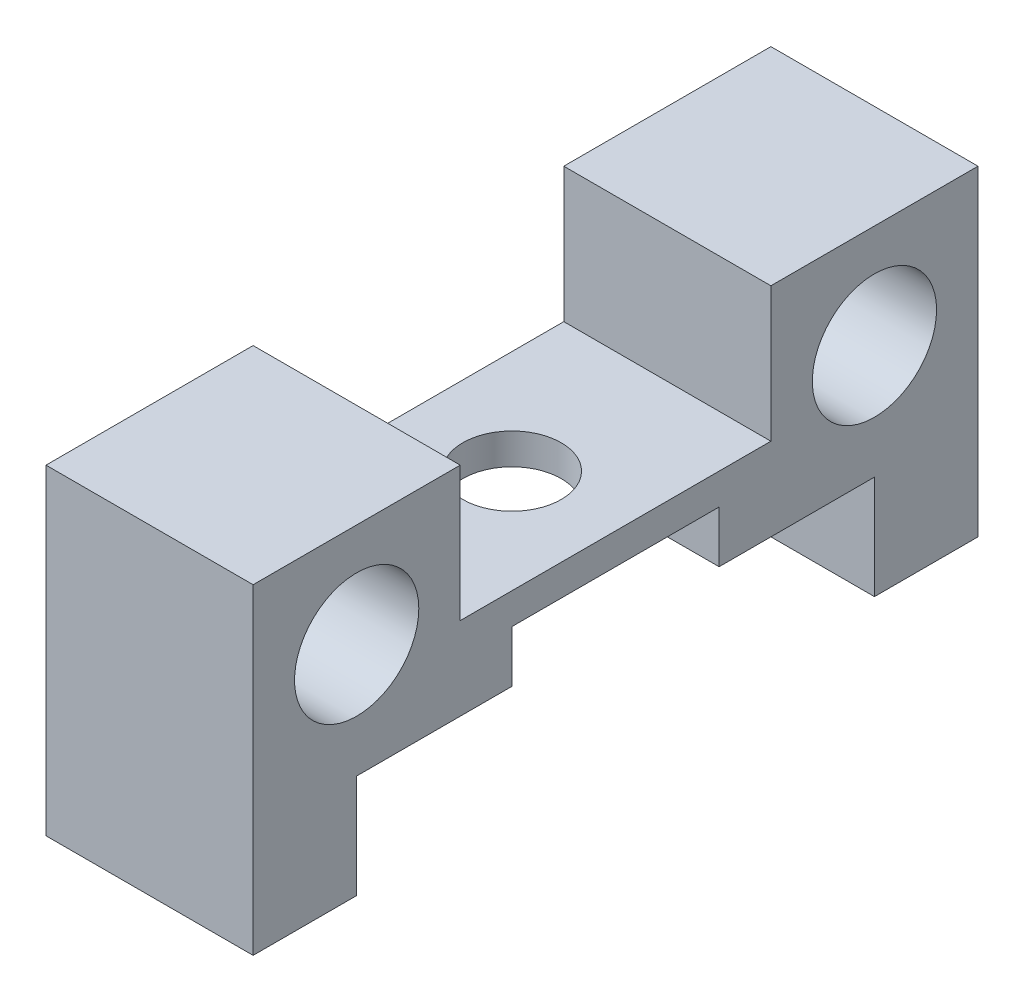
ISO-10303-21;
HEADER;
FILE_DESCRIPTION(('STEP AP214'),'2;1');
FILE_NAME('part.step','',(''),(''),'','','');
FILE_SCHEMA(('AUTOMOTIVE_DESIGN { 1 0 10303 214 1 1 1 1 }'));
ENDSEC;
DATA;
#1=APPLICATION_CONTEXT('core data for automotive mechanical design processes');
#2=APPLICATION_PROTOCOL_DEFINITION('international standard','automotive_design',2000,#1);
#3=PRODUCT_CONTEXT('',#1,'mechanical');
#4=PRODUCT('Part','Part','',(#3));
#5=PRODUCT_RELATED_PRODUCT_CATEGORY('part','',(#4));
#6=PRODUCT_DEFINITION_FORMATION('','',#4);
#7=PRODUCT_DEFINITION_CONTEXT('part definition',#1,'design');
#8=PRODUCT_DEFINITION('design','',#6,#7);
#9=PRODUCT_DEFINITION_SHAPE('','',#8);
#10=(LENGTH_UNIT() NAMED_UNIT(*) SI_UNIT(.MILLI.,.METRE.));
#11=(NAMED_UNIT(*) PLANE_ANGLE_UNIT() SI_UNIT($,.RADIAN.));
#12=(NAMED_UNIT(*) SI_UNIT($,.STERADIAN.) SOLID_ANGLE_UNIT());
#13=UNCERTAINTY_MEASURE_WITH_UNIT(LENGTH_MEASURE(1.E-05),#10,'distance_accuracy_value','');
#14=(GEOMETRIC_REPRESENTATION_CONTEXT(3) GLOBAL_UNCERTAINTY_ASSIGNED_CONTEXT((#13)) GLOBAL_UNIT_ASSIGNED_CONTEXT((#10,
#11,#12)) REPRESENTATION_CONTEXT('',''));
#15=CARTESIAN_POINT('',(0.,0.,0.));
#16=DIRECTION('',(0.,0.,1.));
#17=DIRECTION('',(1.,0.,0.));
#18=AXIS2_PLACEMENT_3D('',#15,#16,#17);
#19=CARTESIAN_POINT('',(0.,0.,70.));
#20=DIRECTION('',(0.,1.,0.));
#21=DIRECTION('',(0.,0.,1.));
#22=AXIS2_PLACEMENT_3D('',#19,#20,#21);
#23=PLANE('',#22);
#24=CARTESIAN_POINT('',(15.,0.,5.));
#25=DIRECTION('',(0.,-1.,0.));
#26=DIRECTION('',(0.,0.,-1.));
#27=AXIS2_PLACEMENT_3D('',#24,#25,#26);
#28=CIRCLE('',#27,1.5);
#29=CARTESIAN_POINT('',(15.,0.,3.5));
#30=VERTEX_POINT('',#29);
#31=EDGE_CURVE('E563',#30,#30,#28,.T.);
#32=ORIENTED_EDGE('',*,*,#31,.F.);
#33=EDGE_LOOP('',(#32));
#34=FACE_BOUND('',#33,.T.);
#35=CARTESIAN_POINT('',(5.,0.,5.));
#36=DIRECTION('',(0.,-1.,0.));
#37=DIRECTION('',(0.,0.,-1.));
#38=AXIS2_PLACEMENT_3D('',#35,#36,#37);
#39=CIRCLE('',#38,1.5);
#40=CARTESIAN_POINT('',(5.,0.,3.5));
#41=VERTEX_POINT('',#40);
#42=EDGE_CURVE('E365',#41,#41,#39,.T.);
#43=ORIENTED_EDGE('',*,*,#42,.F.);
#44=EDGE_LOOP('',(#43));
#45=FACE_BOUND('',#44,.T.);
#46=DIRECTION('',(0.,0.,-1.));
#47=VECTOR('',#46,1.);
#48=CARTESIAN_POINT('',(20.,0.,70.));
#49=LINE('',#48,#47);
#50=CARTESIAN_POINT('',(20.,0.,10.));
#51=VERTEX_POINT('',#50);
#52=CARTESIAN_POINT('',(20.,0.,0.));
#53=VERTEX_POINT('',#52);
#54=EDGE_CURVE('E265',#51,#53,#49,.T.);
#55=ORIENTED_EDGE('',*,*,#54,.F.);
#56=DIRECTION('',(1.,0.,0.));
#57=VECTOR('',#56,1.);
#58=CARTESIAN_POINT('',(0.,0.,10.));
#59=LINE('',#58,#57);
#60=CARTESIAN_POINT('',(0.,0.,10.));
#61=VERTEX_POINT('',#60);
#62=EDGE_CURVE('E207',#61,#51,#59,.T.);
#63=ORIENTED_EDGE('',*,*,#62,.F.);
#64=DIRECTION('',(0.,0.,-1.));
#65=VECTOR('',#64,1.);
#66=CARTESIAN_POINT('',(0.,0.,70.));
#67=LINE('',#66,#65);
#68=CARTESIAN_POINT('',(0.,0.,0.));
#69=VERTEX_POINT('',#68);
#70=EDGE_CURVE('E40',#61,#69,#67,.T.);
#71=ORIENTED_EDGE('',*,*,#70,.T.);
#72=DIRECTION('',(1.,0.,0.));
#73=VECTOR('',#72,1.);
#74=CARTESIAN_POINT('',(0.,0.,0.));
#75=LINE('',#74,#73);
#76=EDGE_CURVE('E250',#69,#53,#75,.T.);
#77=ORIENTED_EDGE('',*,*,#76,.T.);
#78=EDGE_LOOP('',(#55,#63,#71,#77));
#79=FACE_BOUND('',#78,.T.);
#80=ADVANCED_FACE('F31',(#34,#45,#79),#23,.F.);
#81=CARTESIAN_POINT('',(0.,31.,70.));
#82=DIRECTION('',(0.,-1.,0.));
#83=DIRECTION('',(0.,0.,-1.));
#84=AXIS2_PLACEMENT_3D('',#81,#82,#83);
#85=PLANE('',#84);
#86=DIRECTION('',(0.,0.,-1.));
#87=VECTOR('',#86,1.);
#88=CARTESIAN_POINT('',(20.,31.,70.));
#89=LINE('',#88,#87);
#90=CARTESIAN_POINT('',(20.,31.,70.));
#91=VERTEX_POINT('',#90);
#92=CARTESIAN_POINT('',(20.,31.,50.));
#93=VERTEX_POINT('',#92);
#94=EDGE_CURVE('E262',#91,#93,#89,.T.);
#95=ORIENTED_EDGE('',*,*,#94,.T.);
#96=DIRECTION('',(1.,0.,0.));
#97=VECTOR('',#96,1.);
#98=CARTESIAN_POINT('',(0.,31.,50.));
#99=LINE('',#98,#97);
#100=CARTESIAN_POINT('',(0.,31.,50.));
#101=VERTEX_POINT('',#100);
#102=EDGE_CURVE('E229',#101,#93,#99,.T.);
#103=ORIENTED_EDGE('',*,*,#102,.F.);
#104=DIRECTION('',(0.,0.,-1.));
#105=VECTOR('',#104,1.);
#106=CARTESIAN_POINT('',(0.,31.,70.));
#107=LINE('',#106,#105);
#108=CARTESIAN_POINT('',(0.,31.,70.));
#109=VERTEX_POINT('',#108);
#110=EDGE_CURVE('E258',#109,#101,#107,.T.);
#111=ORIENTED_EDGE('',*,*,#110,.F.);
#112=DIRECTION('',(-1.,0.,0.));
#113=VECTOR('',#112,1.);
#114=CARTESIAN_POINT('',(0.,31.,70.));
#115=LINE('',#114,#113);
#116=EDGE_CURVE('E245',#91,#109,#115,.T.);
#117=ORIENTED_EDGE('',*,*,#116,.F.);
#118=EDGE_LOOP('',(#95,#103,#111,#117));
#119=FACE_BOUND('',#118,.T.);
#120=ADVANCED_FACE('F300',(#119),#85,.F.);
#121=CARTESIAN_POINT('',(0.,0.,70.));
#122=DIRECTION('',(1.,0.,0.));
#123=DIRECTION('',(0.,0.,-1.));
#124=AXIS2_PLACEMENT_3D('',#121,#122,#123);
#125=PLANE('',#124);
#126=CARTESIAN_POINT('',(0.,21.,10.));
#127=DIRECTION('',(1.,0.,0.));
#128=DIRECTION('',(0.,0.,-1.));
#129=AXIS2_PLACEMENT_3D('',#126,#127,#128);
#130=CIRCLE('',#129,6.);
#131=CARTESIAN_POINT('',(0.,21.,4.));
#132=VERTEX_POINT('',#131);
#133=EDGE_CURVE('E369',#132,#132,#130,.T.);
#134=ORIENTED_EDGE('',*,*,#133,.T.);
#135=EDGE_LOOP('',(#134));
#136=FACE_BOUND('',#135,.T.);
#137=CARTESIAN_POINT('',(0.,21.,60.));
#138=DIRECTION('',(1.,0.,0.));
#139=DIRECTION('',(0.,0.,-1.));
#140=AXIS2_PLACEMENT_3D('',#137,#138,#139);
#141=CIRCLE('',#140,5.99999999999999);
#142=CARTESIAN_POINT('',(0.,21.,54.));
#143=VERTEX_POINT('',#142);
#144=EDGE_CURVE('E375',#143,#143,#141,.T.);
#145=ORIENTED_EDGE('',*,*,#144,.T.);
#146=EDGE_LOOP('',(#145));
#147=FACE_BOUND('',#146,.T.);
#148=ORIENTED_EDGE('',*,*,#70,.F.);
#149=DIRECTION('',(0.,1.,0.));
#150=VECTOR('',#149,1.);
#151=CARTESIAN_POINT('',(0.,0.,10.));
#152=LINE('',#151,#150);
#153=CARTESIAN_POINT('',(0.,10.,10.));
#154=VERTEX_POINT('',#153);
#155=EDGE_CURVE('E176',#61,#154,#152,.T.);
#156=ORIENTED_EDGE('',*,*,#155,.T.);
#157=DIRECTION('',(0.,0.,1.));
#158=VECTOR('',#157,1.);
#159=CARTESIAN_POINT('',(0.,10.,10.));
#160=LINE('',#159,#158);
#161=CARTESIAN_POINT('',(0.,10.,25.));
#162=VERTEX_POINT('',#161);
#163=EDGE_CURVE('E179',#154,#162,#160,.T.);
#164=ORIENTED_EDGE('',*,*,#163,.T.);
#165=DIRECTION('',(0.,1.,0.));
#166=VECTOR('',#165,1.);
#167=CARTESIAN_POINT('',(0.,10.,25.));
#168=LINE('',#167,#166);
#169=CARTESIAN_POINT('',(0.,15.,25.));
#170=VERTEX_POINT('',#169);
#171=EDGE_CURVE('E182',#162,#170,#168,.T.);
#172=ORIENTED_EDGE('',*,*,#171,.T.);
#173=DIRECTION('',(0.,0.,1.));
#174=VECTOR('',#173,1.);
#175=CARTESIAN_POINT('',(0.,15.,45.));
#176=LINE('',#175,#174);
#177=CARTESIAN_POINT('',(0.,15.,45.));
#178=VERTEX_POINT('',#177);
#179=EDGE_CURVE('E153',#170,#178,#176,.T.);
#180=ORIENTED_EDGE('',*,*,#179,.T.);
#181=DIRECTION('',(0.,-1.,0.));
#182=VECTOR('',#181,1.);
#183=CARTESIAN_POINT('',(0.,9.99999999999999,45.));
#184=LINE('',#183,#182);
#185=CARTESIAN_POINT('',(0.,9.99999999999999,45.));
#186=VERTEX_POINT('',#185);
#187=EDGE_CURVE('E147',#178,#186,#184,.T.);
#188=ORIENTED_EDGE('',*,*,#187,.T.);
#189=DIRECTION('',(0.,0.,1.));
#190=VECTOR('',#189,1.);
#191=CARTESIAN_POINT('',(0.,9.99999999999999,45.));
#192=LINE('',#191,#190);
#193=CARTESIAN_POINT('',(0.,9.99999999999999,60.));
#194=VERTEX_POINT('',#193);
#195=EDGE_CURVE('E156',#186,#194,#192,.T.);
#196=ORIENTED_EDGE('',*,*,#195,.T.);
#197=DIRECTION('',(0.,-1.,0.));
#198=VECTOR('',#197,1.);
#199=CARTESIAN_POINT('',(0.,9.99999999999999,60.));
#200=LINE('',#199,#198);
#201=CARTESIAN_POINT('',(0.,0.,60.));
#202=VERTEX_POINT('',#201);
#203=EDGE_CURVE('E161',#194,#202,#200,.T.);
#204=ORIENTED_EDGE('',*,*,#203,.T.);
#205=CARTESIAN_POINT('',(0.,0.,70.));
#206=VERTEX_POINT('',#205);
#207=EDGE_CURVE('E11',#206,#202,#67,.T.);
#208=ORIENTED_EDGE('',*,*,#207,.F.);
#209=DIRECTION('',(0.,-1.,0.));
#210=VECTOR('',#209,1.);
#211=CARTESIAN_POINT('',(0.,0.,70.));
#212=LINE('',#211,#210);
#213=EDGE_CURVE('E237',#109,#206,#212,.T.);
#214=ORIENTED_EDGE('',*,*,#213,.F.);
#215=ORIENTED_EDGE('',*,*,#110,.T.);
#216=DIRECTION('',(0.,-1.,0.));
#217=VECTOR('',#216,1.);
#218=CARTESIAN_POINT('',(0.,31.,50.));
#219=LINE('',#218,#217);
#220=CARTESIAN_POINT('',(0.,18.,50.));
#221=VERTEX_POINT('',#220);
#222=EDGE_CURVE('E213',#101,#221,#219,.T.);
#223=ORIENTED_EDGE('',*,*,#222,.T.);
#224=DIRECTION('',(0.,0.,-1.));
#225=VECTOR('',#224,1.);
#226=CARTESIAN_POINT('',(0.,18.,50.));
#227=LINE('',#226,#225);
#228=CARTESIAN_POINT('',(0.,18.,20.));
#229=VERTEX_POINT('',#228);
#230=EDGE_CURVE('E216',#221,#229,#227,.T.);
#231=ORIENTED_EDGE('',*,*,#230,.T.);
#232=DIRECTION('',(0.,1.,0.));
#233=VECTOR('',#232,1.);
#234=CARTESIAN_POINT('',(0.,31.,20.));
#235=LINE('',#234,#233);
#236=CARTESIAN_POINT('',(0.,31.,20.));
#237=VERTEX_POINT('',#236);
#238=EDGE_CURVE('E219',#229,#237,#235,.T.);
#239=ORIENTED_EDGE('',*,*,#238,.T.);
#240=CARTESIAN_POINT('',(0.,31.,0.));
#241=VERTEX_POINT('',#240);
#242=EDGE_CURVE('E247',#237,#241,#107,.T.);
#243=ORIENTED_EDGE('',*,*,#242,.T.);
#244=DIRECTION('',(0.,-1.,0.));
#245=VECTOR('',#244,1.);
#246=CARTESIAN_POINT('',(0.,0.,0.));
#247=LINE('',#246,#245);
#248=EDGE_CURVE('E231',#241,#69,#247,.T.);
#249=ORIENTED_EDGE('',*,*,#248,.T.);
#250=EDGE_LOOP('',(#148,#156,#164,#172,#180,#188,#196,#204,#208,#214,#215,#223,#231,#239,#243,#249));
#251=FACE_BOUND('',#250,.T.);
#252=ADVANCED_FACE('F33',(#136,#147,#251),#125,.F.);
#253=CARTESIAN_POINT('',(15.,0.,65.));
#254=DIRECTION('',(0.,-1.,0.));
#255=DIRECTION('',(0.,0.,-1.));
#256=AXIS2_PLACEMENT_3D('',#253,#254,#255);
#257=CIRCLE('',#256,1.5);
#258=CARTESIAN_POINT('',(15.,0.,63.5));
#259=VERTEX_POINT('',#258);
#260=EDGE_CURVE('E353',#259,#259,#257,.T.);
#261=ORIENTED_EDGE('',*,*,#260,.F.);
#262=EDGE_LOOP('',(#261));
#263=FACE_BOUND('',#262,.T.);
#264=CARTESIAN_POINT('',(5.,0.,65.));
#265=DIRECTION('',(0.,-1.,0.));
#266=DIRECTION('',(0.,0.,-1.));
#267=AXIS2_PLACEMENT_3D('',#264,#265,#266);
#268=CIRCLE('',#267,1.5);
#269=CARTESIAN_POINT('',(5.,0.,63.5));
#270=VERTEX_POINT('',#269);
#271=EDGE_CURVE('E356',#270,#270,#268,.T.);
#272=ORIENTED_EDGE('',*,*,#271,.F.);
#273=EDGE_LOOP('',(#272));
#274=FACE_BOUND('',#273,.T.);
#275=ORIENTED_EDGE('',*,*,#207,.T.);
#276=DIRECTION('',(1.,0.,0.));
#277=VECTOR('',#276,1.);
#278=CARTESIAN_POINT('',(0.,0.,60.));
#279=LINE('',#278,#277);
#280=CARTESIAN_POINT('',(20.,0.,60.));
#281=VERTEX_POINT('',#280);
#282=EDGE_CURVE('E209',#202,#281,#279,.T.);
#283=ORIENTED_EDGE('',*,*,#282,.T.);
#284=CARTESIAN_POINT('',(20.,0.,70.));
#285=VERTEX_POINT('',#284);
#286=EDGE_CURVE('E266',#285,#281,#49,.T.);
#287=ORIENTED_EDGE('',*,*,#286,.F.);
#288=DIRECTION('',(1.,0.,0.));
#289=VECTOR('',#288,1.);
#290=CARTESIAN_POINT('',(0.,0.,70.));
#291=LINE('',#290,#289);
#292=EDGE_CURVE('E240',#206,#285,#291,.T.);
#293=ORIENTED_EDGE('',*,*,#292,.F.);
#294=EDGE_LOOP('',(#275,#283,#287,#293));
#295=FACE_BOUND('',#294,.T.);
#296=ADVANCED_FACE('F307',(#263,#274,#295),#23,.F.);
#297=CARTESIAN_POINT('',(20.,0.,70.));
#298=DIRECTION('',(-1.,0.,0.));
#299=DIRECTION('',(0.,0.,1.));
#300=AXIS2_PLACEMENT_3D('',#297,#298,#299);
#301=PLANE('',#300);
#302=CARTESIAN_POINT('',(20.,21.,10.));
#303=DIRECTION('',(1.,0.,0.));
#304=DIRECTION('',(0.,0.,-1.));
#305=AXIS2_PLACEMENT_3D('',#302,#303,#304);
#306=CIRCLE('',#305,6.);
#307=CARTESIAN_POINT('',(20.,21.,4.));
#308=VERTEX_POINT('',#307);
#309=EDGE_CURVE('E362',#308,#308,#306,.T.);
#310=ORIENTED_EDGE('',*,*,#309,.F.);
#311=EDGE_LOOP('',(#310));
#312=FACE_BOUND('',#311,.T.);
#313=CARTESIAN_POINT('',(20.,21.,60.));
#314=DIRECTION('',(1.,0.,0.));
#315=DIRECTION('',(0.,0.,-1.));
#316=AXIS2_PLACEMENT_3D('',#313,#314,#315);
#317=CIRCLE('',#316,5.99999999999999);
#318=CARTESIAN_POINT('',(20.,21.,54.));
#319=VERTEX_POINT('',#318);
#320=EDGE_CURVE('E372',#319,#319,#317,.T.);
#321=ORIENTED_EDGE('',*,*,#320,.F.);
#322=EDGE_LOOP('',(#321));
#323=FACE_BOUND('',#322,.T.);
#324=DIRECTION('',(0.,0.,1.));
#325=VECTOR('',#324,1.);
#326=CARTESIAN_POINT('',(20.,10.,10.));
#327=LINE('',#326,#325);
#328=CARTESIAN_POINT('',(20.,10.,10.));
#329=VERTEX_POINT('',#328);
#330=CARTESIAN_POINT('',(20.,10.,25.));
#331=VERTEX_POINT('',#330);
#332=EDGE_CURVE('E193',#329,#331,#327,.T.);
#333=ORIENTED_EDGE('',*,*,#332,.F.);
#334=DIRECTION('',(0.,1.,0.));
#335=VECTOR('',#334,1.);
#336=CARTESIAN_POINT('',(20.,0.,10.));
#337=LINE('',#336,#335);
#338=EDGE_CURVE('E190',#51,#329,#337,.T.);
#339=ORIENTED_EDGE('',*,*,#338,.F.);
#340=ORIENTED_EDGE('',*,*,#54,.T.);
#341=DIRECTION('',(0.,1.,0.));
#342=VECTOR('',#341,1.);
#343=CARTESIAN_POINT('',(20.,0.,0.));
#344=LINE('',#343,#342);
#345=CARTESIAN_POINT('',(20.,31.,0.));
#346=VERTEX_POINT('',#345);
#347=EDGE_CURVE('E253',#53,#346,#344,.T.);
#348=ORIENTED_EDGE('',*,*,#347,.T.);
#349=CARTESIAN_POINT('',(20.,31.,20.));
#350=VERTEX_POINT('',#349);
#351=EDGE_CURVE('E261',#350,#346,#89,.T.);
#352=ORIENTED_EDGE('',*,*,#351,.F.);
#353=DIRECTION('',(0.,1.,0.));
#354=VECTOR('',#353,1.);
#355=CARTESIAN_POINT('',(20.,31.,20.));
#356=LINE('',#355,#354);
#357=CARTESIAN_POINT('',(20.,18.,20.));
#358=VERTEX_POINT('',#357);
#359=EDGE_CURVE('E55',#358,#350,#356,.T.);
#360=ORIENTED_EDGE('',*,*,#359,.F.);
#361=DIRECTION('',(0.,0.,-1.));
#362=VECTOR('',#361,1.);
#363=CARTESIAN_POINT('',(20.,18.,50.));
#364=LINE('',#363,#362);
#365=CARTESIAN_POINT('',(20.,18.,50.));
#366=VERTEX_POINT('',#365);
#367=EDGE_CURVE('E225',#366,#358,#364,.T.);
#368=ORIENTED_EDGE('',*,*,#367,.F.);
#369=DIRECTION('',(0.,-1.,0.));
#370=VECTOR('',#369,1.);
#371=CARTESIAN_POINT('',(20.,31.,50.));
#372=LINE('',#371,#370);
#373=EDGE_CURVE('E200',#93,#366,#372,.T.);
#374=ORIENTED_EDGE('',*,*,#373,.F.);
#375=ORIENTED_EDGE('',*,*,#94,.F.);
#376=DIRECTION('',(0.,1.,0.));
#377=VECTOR('',#376,1.);
#378=CARTESIAN_POINT('',(20.,0.,70.));
#379=LINE('',#378,#377);
#380=EDGE_CURVE('E243',#285,#91,#379,.T.);
#381=ORIENTED_EDGE('',*,*,#380,.F.);
#382=ORIENTED_EDGE('',*,*,#286,.T.);
#383=DIRECTION('',(0.,-1.,0.));
#384=VECTOR('',#383,1.);
#385=CARTESIAN_POINT('',(20.,9.99999999999999,60.));
#386=LINE('',#385,#384);
#387=CARTESIAN_POINT('',(20.,9.99999999999999,60.));
#388=VERTEX_POINT('',#387);
#389=EDGE_CURVE('E188',#388,#281,#386,.T.);
#390=ORIENTED_EDGE('',*,*,#389,.F.);
#391=DIRECTION('',(0.,0.,1.));
#392=VECTOR('',#391,1.);
#393=CARTESIAN_POINT('',(20.,9.99999999999999,45.));
#394=LINE('',#393,#392);
#395=CARTESIAN_POINT('',(20.,9.99999999999999,45.));
#396=VERTEX_POINT('',#395);
#397=EDGE_CURVE('E186',#396,#388,#394,.T.);
#398=ORIENTED_EDGE('',*,*,#397,.F.);
#399=DIRECTION('',(0.,-1.,0.));
#400=VECTOR('',#399,1.);
#401=CARTESIAN_POINT('',(20.,9.99999999999999,45.));
#402=LINE('',#401,#400);
#403=CARTESIAN_POINT('',(20.,15.,45.));
#404=VERTEX_POINT('',#403);
#405=EDGE_CURVE('E47',#404,#396,#402,.T.);
#406=ORIENTED_EDGE('',*,*,#405,.F.);
#407=DIRECTION('',(0.,0.,1.));
#408=VECTOR('',#407,1.);
#409=CARTESIAN_POINT('',(20.,15.,45.));
#410=LINE('',#409,#408);
#411=CARTESIAN_POINT('',(20.,15.,25.));
#412=VERTEX_POINT('',#411);
#413=EDGE_CURVE('E166',#412,#404,#410,.T.);
#414=ORIENTED_EDGE('',*,*,#413,.F.);
#415=DIRECTION('',(0.,1.,0.));
#416=VECTOR('',#415,1.);
#417=CARTESIAN_POINT('',(20.,10.,25.));
#418=LINE('',#417,#416);
#419=EDGE_CURVE('E169',#331,#412,#418,.T.);
#420=ORIENTED_EDGE('',*,*,#419,.F.);
#421=EDGE_LOOP('',(#333,#339,#340,#348,#352,#360,#368,#374,#375,#381,#382,#390,#398,#406,#414,#420));
#422=FACE_BOUND('',#421,.T.);
#423=ADVANCED_FACE('F275',(#312,#323,#422),#301,.F.);
#424=ORIENTED_EDGE('',*,*,#242,.F.);
#425=DIRECTION('',(1.,0.,0.));
#426=VECTOR('',#425,1.);
#427=CARTESIAN_POINT('',(0.,31.,20.));
#428=LINE('',#427,#426);
#429=EDGE_CURVE('E232',#237,#350,#428,.T.);
#430=ORIENTED_EDGE('',*,*,#429,.T.);
#431=ORIENTED_EDGE('',*,*,#351,.T.);
#432=DIRECTION('',(-1.,0.,0.));
#433=VECTOR('',#432,1.);
#434=CARTESIAN_POINT('',(0.,31.,0.));
#435=LINE('',#434,#433);
#436=EDGE_CURVE('E241',#346,#241,#435,.T.);
#437=ORIENTED_EDGE('',*,*,#436,.T.);
#438=EDGE_LOOP('',(#424,#430,#431,#437));
#439=FACE_BOUND('',#438,.T.);
#440=ADVANCED_FACE('F287',(#439),#85,.F.);
#441=CARTESIAN_POINT('',(0.,31.,70.));
#442=DIRECTION('',(0.,0.,-1.));
#443=DIRECTION('',(-1.,0.,0.));
#444=AXIS2_PLACEMENT_3D('',#441,#442,#443);
#445=PLANE('',#444);
#446=ORIENTED_EDGE('',*,*,#213,.T.);
#447=ORIENTED_EDGE('',*,*,#292,.T.);
#448=ORIENTED_EDGE('',*,*,#380,.T.);
#449=ORIENTED_EDGE('',*,*,#116,.T.);
#450=EDGE_LOOP('',(#446,#447,#448,#449));
#451=FACE_BOUND('',#450,.T.);
#452=ADVANCED_FACE('F305',(#451),#445,.F.);
#453=CARTESIAN_POINT('',(0.,31.,0.));
#454=DIRECTION('',(0.,0.,-1.));
#455=DIRECTION('',(-1.,0.,0.));
#456=AXIS2_PLACEMENT_3D('',#453,#454,#455);
#457=PLANE('',#456);
#458=ORIENTED_EDGE('',*,*,#248,.F.);
#459=ORIENTED_EDGE('',*,*,#436,.F.);
#460=ORIENTED_EDGE('',*,*,#347,.F.);
#461=ORIENTED_EDGE('',*,*,#76,.F.);
#462=EDGE_LOOP('',(#458,#459,#460,#461));
#463=FACE_BOUND('',#462,.T.);
#464=ADVANCED_FACE('F284',(#463),#457,.T.);
#465=CARTESIAN_POINT('',(0.,31.,50.));
#466=DIRECTION('',(0.,0.,1.));
#467=DIRECTION('',(0.,-1.,0.));
#468=AXIS2_PLACEMENT_3D('',#465,#466,#467);
#469=PLANE('',#468);
#470=ORIENTED_EDGE('',*,*,#373,.T.);
#471=DIRECTION('',(1.,0.,0.));
#472=VECTOR('',#471,1.);
#473=CARTESIAN_POINT('',(0.,18.,50.));
#474=LINE('',#473,#472);
#475=EDGE_CURVE('E222',#221,#366,#474,.T.);
#476=ORIENTED_EDGE('',*,*,#475,.F.);
#477=ORIENTED_EDGE('',*,*,#222,.F.);
#478=ORIENTED_EDGE('',*,*,#102,.T.);
#479=EDGE_LOOP('',(#470,#476,#477,#478));
#480=FACE_BOUND('',#479,.T.);
#481=ADVANCED_FACE('F296',(#480),#469,.F.);
#482=CARTESIAN_POINT('',(0.,31.,20.));
#483=DIRECTION('',(0.,0.,-1.));
#484=DIRECTION('',(0.,1.,0.));
#485=AXIS2_PLACEMENT_3D('',#482,#483,#484);
#486=PLANE('',#485);
#487=ORIENTED_EDGE('',*,*,#359,.T.);
#488=ORIENTED_EDGE('',*,*,#429,.F.);
#489=ORIENTED_EDGE('',*,*,#238,.F.);
#490=DIRECTION('',(1.,0.,0.));
#491=VECTOR('',#490,1.);
#492=CARTESIAN_POINT('',(0.,18.,20.));
#493=LINE('',#492,#491);
#494=EDGE_CURVE('E234',#229,#358,#493,.T.);
#495=ORIENTED_EDGE('',*,*,#494,.T.);
#496=EDGE_LOOP('',(#487,#488,#489,#495));
#497=FACE_BOUND('',#496,.T.);
#498=ADVANCED_FACE('F322',(#497),#486,.F.);
#499=CARTESIAN_POINT('',(0.,18.,50.));
#500=DIRECTION('',(0.,-1.,0.));
#501=DIRECTION('',(0.,0.,-1.));
#502=AXIS2_PLACEMENT_3D('',#499,#500,#501);
#503=PLANE('',#502);
#504=CARTESIAN_POINT('',(10.,18.,35.));
#505=DIRECTION('',(0.,1.,0.));
#506=DIRECTION('',(0.,0.,1.));
#507=AXIS2_PLACEMENT_3D('',#504,#505,#506);
#508=CIRCLE('',#507,4.75000000000001);
#509=CARTESIAN_POINT('',(10.,18.,39.75));
#510=VERTEX_POINT('',#509);
#511=EDGE_CURVE('E172',#510,#510,#508,.T.);
#512=ORIENTED_EDGE('',*,*,#511,.F.);
#513=EDGE_LOOP('',(#512));
#514=FACE_BOUND('',#513,.T.);
#515=ORIENTED_EDGE('',*,*,#367,.T.);
#516=ORIENTED_EDGE('',*,*,#494,.F.);
#517=ORIENTED_EDGE('',*,*,#230,.F.);
#518=ORIENTED_EDGE('',*,*,#475,.T.);
#519=EDGE_LOOP('',(#515,#516,#517,#518));
#520=FACE_BOUND('',#519,.T.);
#521=ADVANCED_FACE('F292',(#514,#520),#503,.F.);
#522=CARTESIAN_POINT('',(0.,9.99999999999999,45.));
#523=DIRECTION('',(0.,0.,1.));
#524=DIRECTION('',(0.,-1.,0.));
#525=AXIS2_PLACEMENT_3D('',#522,#523,#524);
#526=PLANE('',#525);
#527=ORIENTED_EDGE('',*,*,#405,.T.);
#528=DIRECTION('',(1.,0.,0.));
#529=VECTOR('',#528,1.);
#530=CARTESIAN_POINT('',(0.,9.99999999999999,45.));
#531=LINE('',#530,#529);
#532=EDGE_CURVE('E143',#186,#396,#531,.T.);
#533=ORIENTED_EDGE('',*,*,#532,.F.);
#534=ORIENTED_EDGE('',*,*,#187,.F.);
#535=DIRECTION('',(1.,0.,0.));
#536=VECTOR('',#535,1.);
#537=CARTESIAN_POINT('',(0.,15.,45.));
#538=LINE('',#537,#536);
#539=EDGE_CURVE('E198',#178,#404,#538,.T.);
#540=ORIENTED_EDGE('',*,*,#539,.T.);
#541=EDGE_LOOP('',(#527,#533,#534,#540));
#542=FACE_BOUND('',#541,.T.);
#543=ADVANCED_FACE('F145',(#542),#526,.F.);
#544=CARTESIAN_POINT('',(0.,15.,45.));
#545=DIRECTION('',(0.,1.,0.));
#546=DIRECTION('',(0.,0.,1.));
#547=AXIS2_PLACEMENT_3D('',#544,#545,#546);
#548=PLANE('',#547);
#549=CARTESIAN_POINT('',(10.,15.,35.));
#550=DIRECTION('',(0.,1.,0.));
#551=DIRECTION('',(0.,0.,1.));
#552=AXIS2_PLACEMENT_3D('',#549,#550,#551);
#553=CIRCLE('',#552,4.75000000000001);
#554=CARTESIAN_POINT('',(10.,15.,39.75));
#555=VERTEX_POINT('',#554);
#556=EDGE_CURVE('E35',#555,#555,#553,.T.);
#557=ORIENTED_EDGE('',*,*,#556,.T.);
#558=EDGE_LOOP('',(#557));
#559=FACE_BOUND('',#558,.T.);
#560=ORIENTED_EDGE('',*,*,#413,.T.);
#561=ORIENTED_EDGE('',*,*,#539,.F.);
#562=ORIENTED_EDGE('',*,*,#179,.F.);
#563=DIRECTION('',(1.,0.,0.));
#564=VECTOR('',#563,1.);
#565=CARTESIAN_POINT('',(0.,15.,25.));
#566=LINE('',#565,#564);
#567=EDGE_CURVE('E201',#170,#412,#566,.T.);
#568=ORIENTED_EDGE('',*,*,#567,.T.);
#569=EDGE_LOOP('',(#560,#561,#562,#568));
#570=FACE_BOUND('',#569,.T.);
#571=ADVANCED_FACE('F313',(#559,#570),#548,.F.);
#572=CARTESIAN_POINT('',(0.,10.,25.));
#573=DIRECTION('',(0.,0.,-1.));
#574=DIRECTION('',(-1.,0.,0.));
#575=AXIS2_PLACEMENT_3D('',#572,#573,#574);
#576=PLANE('',#575);
#577=ORIENTED_EDGE('',*,*,#419,.T.);
#578=ORIENTED_EDGE('',*,*,#567,.F.);
#579=ORIENTED_EDGE('',*,*,#171,.F.);
#580=DIRECTION('',(1.,0.,0.));
#581=VECTOR('',#580,1.);
#582=CARTESIAN_POINT('',(0.,10.,25.));
#583=LINE('',#582,#581);
#584=EDGE_CURVE('E203',#162,#331,#583,.T.);
#585=ORIENTED_EDGE('',*,*,#584,.T.);
#586=EDGE_LOOP('',(#577,#578,#579,#585));
#587=FACE_BOUND('',#586,.T.);
#588=ADVANCED_FACE('F316',(#587),#576,.F.);
#589=CARTESIAN_POINT('',(0.,10.,10.));
#590=DIRECTION('',(0.,1.,0.));
#591=DIRECTION('',(0.,0.,1.));
#592=AXIS2_PLACEMENT_3D('',#589,#590,#591);
#593=PLANE('',#592);
#594=ORIENTED_EDGE('',*,*,#332,.T.);
#595=ORIENTED_EDGE('',*,*,#584,.F.);
#596=ORIENTED_EDGE('',*,*,#163,.F.);
#597=DIRECTION('',(1.,0.,0.));
#598=VECTOR('',#597,1.);
#599=CARTESIAN_POINT('',(0.,10.,10.));
#600=LINE('',#599,#598);
#601=EDGE_CURVE('E205',#154,#329,#600,.T.);
#602=ORIENTED_EDGE('',*,*,#601,.T.);
#603=EDGE_LOOP('',(#594,#595,#596,#602));
#604=FACE_BOUND('',#603,.T.);
#605=ADVANCED_FACE('F319',(#604),#593,.F.);
#606=CARTESIAN_POINT('',(0.,0.,10.));
#607=DIRECTION('',(0.,0.,-1.));
#608=DIRECTION('',(0.,1.,0.));
#609=AXIS2_PLACEMENT_3D('',#606,#607,#608);
#610=PLANE('',#609);
#611=ORIENTED_EDGE('',*,*,#338,.T.);
#612=ORIENTED_EDGE('',*,*,#601,.F.);
#613=ORIENTED_EDGE('',*,*,#155,.F.);
#614=ORIENTED_EDGE('',*,*,#62,.T.);
#615=EDGE_LOOP('',(#611,#612,#613,#614));
#616=FACE_BOUND('',#615,.T.);
#617=ADVANCED_FACE('F321',(#616),#610,.F.);
#618=CARTESIAN_POINT('',(0.,9.99999999999999,60.));
#619=DIRECTION('',(0.,0.,1.));
#620=DIRECTION('',(0.,-1.,0.));
#621=AXIS2_PLACEMENT_3D('',#618,#619,#620);
#622=PLANE('',#621);
#623=ORIENTED_EDGE('',*,*,#389,.T.);
#624=ORIENTED_EDGE('',*,*,#282,.F.);
#625=ORIENTED_EDGE('',*,*,#203,.F.);
#626=DIRECTION('',(1.,0.,0.));
#627=VECTOR('',#626,1.);
#628=CARTESIAN_POINT('',(0.,9.99999999999999,60.));
#629=LINE('',#628,#627);
#630=EDGE_CURVE('E152',#194,#388,#629,.T.);
#631=ORIENTED_EDGE('',*,*,#630,.T.);
#632=EDGE_LOOP('',(#623,#624,#625,#631));
#633=FACE_BOUND('',#632,.T.);
#634=ADVANCED_FACE('F309',(#633),#622,.F.);
#635=CARTESIAN_POINT('',(0.,9.99999999999999,45.));
#636=DIRECTION('',(0.,1.,0.));
#637=DIRECTION('',(0.,0.,1.));
#638=AXIS2_PLACEMENT_3D('',#635,#636,#637);
#639=PLANE('',#638);
#640=ORIENTED_EDGE('',*,*,#397,.T.);
#641=ORIENTED_EDGE('',*,*,#630,.F.);
#642=ORIENTED_EDGE('',*,*,#195,.F.);
#643=ORIENTED_EDGE('',*,*,#532,.T.);
#644=EDGE_LOOP('',(#640,#641,#642,#643));
#645=FACE_BOUND('',#644,.T.);
#646=ADVANCED_FACE('F157',(#645),#639,.F.);
#647=CARTESIAN_POINT('',(10.,0.,35.));
#648=DIRECTION('',(0.,1.,0.));
#649=DIRECTION('',(0.,0.,1.));
#650=AXIS2_PLACEMENT_3D('',#647,#648,#649);
#651=CYLINDRICAL_SURFACE('',#650,4.75000000000001);
#652=ORIENTED_EDGE('',*,*,#511,.T.);
#653=EDGE_LOOP('',(#652));
#654=FACE_BOUND('',#653,.T.);
#655=ORIENTED_EDGE('',*,*,#556,.F.);
#656=EDGE_LOOP('',(#655));
#657=FACE_BOUND('',#656,.T.);
#658=ADVANCED_FACE('F384',(#654,#657),#651,.F.);
#659=CARTESIAN_POINT('',(0.,21.,60.));
#660=DIRECTION('',(1.,0.,0.));
#661=DIRECTION('',(0.,0.,-1.));
#662=AXIS2_PLACEMENT_3D('',#659,#660,#661);
#663=CYLINDRICAL_SURFACE('',#662,5.99999999999999);
#664=ORIENTED_EDGE('',*,*,#144,.F.);
#665=EDGE_LOOP('',(#664));
#666=FACE_BOUND('',#665,.T.);
#667=ORIENTED_EDGE('',*,*,#320,.T.);
#668=EDGE_LOOP('',(#667));
#669=FACE_BOUND('',#668,.T.);
#670=ADVANCED_FACE('F380',(#666,#669),#663,.F.);
#671=CARTESIAN_POINT('',(0.,21.,10.));
#672=DIRECTION('',(1.,0.,0.));
#673=DIRECTION('',(0.,0.,-1.));
#674=AXIS2_PLACEMENT_3D('',#671,#672,#673);
#675=CYLINDRICAL_SURFACE('',#674,6.);
#676=ORIENTED_EDGE('',*,*,#133,.F.);
#677=EDGE_LOOP('',(#676));
#678=FACE_BOUND('',#677,.T.);
#679=ORIENTED_EDGE('',*,*,#309,.T.);
#680=EDGE_LOOP('',(#679));
#681=FACE_BOUND('',#680,.T.);
#682=ADVANCED_FACE('F383',(#678,#681),#675,.F.);
#683=CARTESIAN_POINT('',(5.,10.,65.));
#684=DIRECTION('',(0.,-1.,0.));
#685=DIRECTION('',(0.,0.,-1.));
#686=AXIS2_PLACEMENT_3D('',#683,#684,#685);
#687=CYLINDRICAL_SURFACE('',#686,1.5);
#688=CARTESIAN_POINT('',(5.,10.,65.));
#689=DIRECTION('',(0.,-1.,0.));
#690=DIRECTION('',(0.,0.,-1.));
#691=AXIS2_PLACEMENT_3D('',#688,#689,#690);
#692=CIRCLE('',#691,1.5);
#693=CARTESIAN_POINT('',(5.,10.,63.5));
#694=VERTEX_POINT('',#693);
#695=EDGE_CURVE('E358',#694,#694,#692,.T.);
#696=ORIENTED_EDGE('',*,*,#695,.F.);
#697=EDGE_LOOP('',(#696));
#698=FACE_BOUND('',#697,.T.);
#699=ORIENTED_EDGE('',*,*,#271,.T.);
#700=EDGE_LOOP('',(#699));
#701=FACE_BOUND('',#700,.T.);
#702=ADVANCED_FACE('F391',(#698,#701),#687,.F.);
#703=CARTESIAN_POINT('',(5.,10.,65.));
#704=DIRECTION('',(0.,-1.,0.));
#705=DIRECTION('',(0.,0.,-1.));
#706=AXIS2_PLACEMENT_3D('',#703,#704,#705);
#707=PLANE('',#706);
#708=ORIENTED_EDGE('',*,*,#695,.T.);
#709=EDGE_LOOP('',(#708));
#710=FACE_BOUND('',#709,.T.);
#711=ADVANCED_FACE('F487',(#710),#707,.T.);
#712=CARTESIAN_POINT('',(5.,10.,5.));
#713=DIRECTION('',(0.,-1.,0.));
#714=DIRECTION('',(0.,0.,-1.));
#715=AXIS2_PLACEMENT_3D('',#712,#713,#714);
#716=CYLINDRICAL_SURFACE('',#715,1.5);
#717=CARTESIAN_POINT('',(5.,10.,5.));
#718=DIRECTION('',(0.,-1.,0.));
#719=DIRECTION('',(0.,0.,-1.));
#720=AXIS2_PLACEMENT_3D('',#717,#718,#719);
#721=CIRCLE('',#720,1.5);
#722=CARTESIAN_POINT('',(5.,10.,3.5));
#723=VERTEX_POINT('',#722);
#724=EDGE_CURVE('E359',#723,#723,#721,.T.);
#725=ORIENTED_EDGE('',*,*,#724,.F.);
#726=EDGE_LOOP('',(#725));
#727=FACE_BOUND('',#726,.T.);
#728=ORIENTED_EDGE('',*,*,#42,.T.);
#729=EDGE_LOOP('',(#728));
#730=FACE_BOUND('',#729,.T.);
#731=ADVANCED_FACE('F496',(#727,#730),#716,.F.);
#732=CARTESIAN_POINT('',(5.,10.,5.));
#733=DIRECTION('',(0.,-1.,0.));
#734=DIRECTION('',(0.,0.,-1.));
#735=AXIS2_PLACEMENT_3D('',#732,#733,#734);
#736=PLANE('',#735);
#737=ORIENTED_EDGE('',*,*,#724,.T.);
#738=EDGE_LOOP('',(#737));
#739=FACE_BOUND('',#738,.T.);
#740=ADVANCED_FACE('F506',(#739),#736,.T.);
#741=CARTESIAN_POINT('',(15.,10.,65.));
#742=DIRECTION('',(0.,-1.,0.));
#743=DIRECTION('',(0.,0.,-1.));
#744=AXIS2_PLACEMENT_3D('',#741,#742,#743);
#745=CYLINDRICAL_SURFACE('',#744,1.5);
#746=CARTESIAN_POINT('',(15.,10.,65.));
#747=DIRECTION('',(0.,-1.,0.));
#748=DIRECTION('',(0.,0.,-1.));
#749=AXIS2_PLACEMENT_3D('',#746,#747,#748);
#750=CIRCLE('',#749,1.5);
#751=CARTESIAN_POINT('',(15.,10.,63.5));
#752=VERTEX_POINT('',#751);
#753=EDGE_CURVE('E565',#752,#752,#750,.T.);
#754=ORIENTED_EDGE('',*,*,#753,.F.);
#755=EDGE_LOOP('',(#754));
#756=FACE_BOUND('',#755,.T.);
#757=ORIENTED_EDGE('',*,*,#260,.T.);
#758=EDGE_LOOP('',(#757));
#759=FACE_BOUND('',#758,.T.);
#760=ADVANCED_FACE('F516',(#756,#759),#745,.F.);
#761=CARTESIAN_POINT('',(15.,10.,65.));
#762=DIRECTION('',(0.,-1.,0.));
#763=DIRECTION('',(0.,0.,-1.));
#764=AXIS2_PLACEMENT_3D('',#761,#762,#763);
#765=PLANE('',#764);
#766=ORIENTED_EDGE('',*,*,#753,.T.);
#767=EDGE_LOOP('',(#766));
#768=FACE_BOUND('',#767,.T.);
#769=ADVANCED_FACE('F526',(#768),#765,.T.);
#770=CARTESIAN_POINT('',(15.,10.,5.));
#771=DIRECTION('',(0.,-1.,0.));
#772=DIRECTION('',(0.,0.,-1.));
#773=AXIS2_PLACEMENT_3D('',#770,#771,#772);
#774=CYLINDRICAL_SURFACE('',#773,1.5);
#775=CARTESIAN_POINT('',(15.,10.,5.));
#776=DIRECTION('',(0.,-1.,0.));
#777=DIRECTION('',(0.,0.,-1.));
#778=AXIS2_PLACEMENT_3D('',#775,#776,#777);
#779=CIRCLE('',#778,1.5);
#780=CARTESIAN_POINT('',(15.,10.,3.5));
#781=VERTEX_POINT('',#780);
#782=EDGE_CURVE('E562',#781,#781,#779,.T.);
#783=ORIENTED_EDGE('',*,*,#782,.F.);
#784=EDGE_LOOP('',(#783));
#785=FACE_BOUND('',#784,.T.);
#786=ORIENTED_EDGE('',*,*,#31,.T.);
#787=EDGE_LOOP('',(#786));
#788=FACE_BOUND('',#787,.T.);
#789=ADVANCED_FACE('F536',(#785,#788),#774,.F.);
#790=CARTESIAN_POINT('',(15.,10.,5.));
#791=DIRECTION('',(0.,-1.,0.));
#792=DIRECTION('',(0.,0.,-1.));
#793=AXIS2_PLACEMENT_3D('',#790,#791,#792);
#794=PLANE('',#793);
#795=ORIENTED_EDGE('',*,*,#782,.T.);
#796=EDGE_LOOP('',(#795));
#797=FACE_BOUND('',#796,.T.);
#798=ADVANCED_FACE('F546',(#797),#794,.T.);
#799=CLOSED_SHELL('',(#80,#120,#252,#296,#423,#440,#452,#464,#481,#498,#521,#543,#571,#588,#605,
#617,#634,#646,#658,#670,#682,#702,#711,#731,#740,#760,#769,#789,#798));
#800=MANIFOLD_SOLID_BREP('B2',#799);
#801=ADVANCED_BREP_SHAPE_REPRESENTATION('',(#18,#800),#14);
#802=SHAPE_DEFINITION_REPRESENTATION(#9,#801);
ENDSEC;
END-ISO-10303-21;
